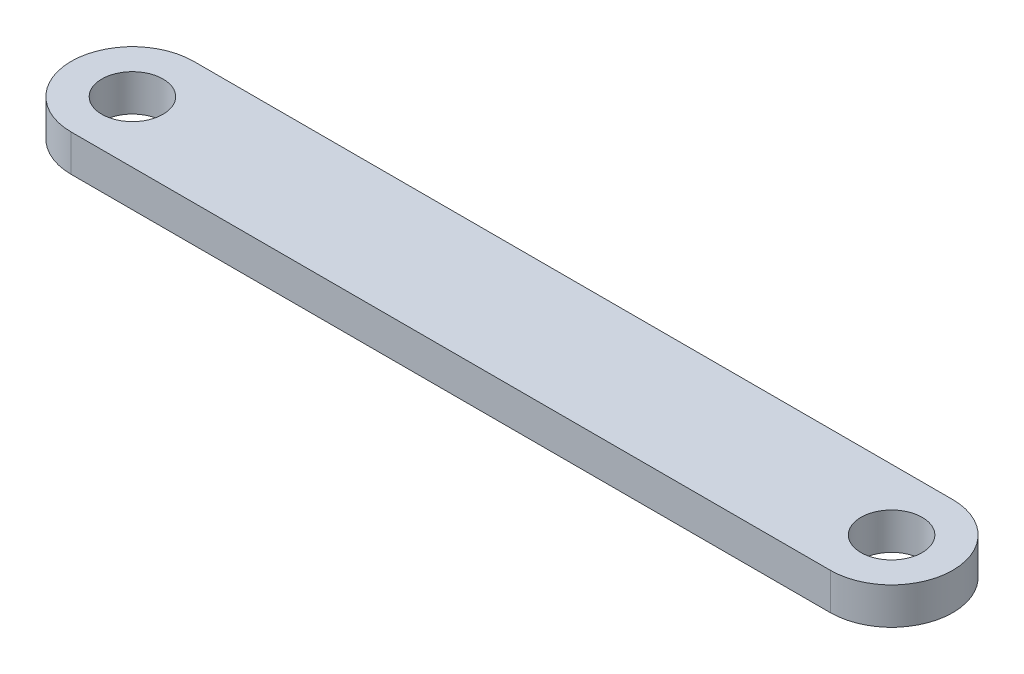
ISO-10303-21;
HEADER;
FILE_DESCRIPTION(('STEP AP214'),'2;1');
FILE_NAME('part.step','',(''),(''),'','','');
FILE_SCHEMA(('AUTOMOTIVE_DESIGN { 1 0 10303 214 1 1 1 1 }'));
ENDSEC;
DATA;
#1=APPLICATION_CONTEXT('core data for automotive mechanical design processes');
#2=APPLICATION_PROTOCOL_DEFINITION('international standard','automotive_design',2000,#1);
#3=PRODUCT_CONTEXT('',#1,'mechanical');
#4=PRODUCT('Part','Part','',(#3));
#5=PRODUCT_RELATED_PRODUCT_CATEGORY('part','',(#4));
#6=PRODUCT_DEFINITION_FORMATION('','',#4);
#7=PRODUCT_DEFINITION_CONTEXT('part definition',#1,'design');
#8=PRODUCT_DEFINITION('design','',#6,#7);
#9=PRODUCT_DEFINITION_SHAPE('','',#8);
#10=(LENGTH_UNIT() NAMED_UNIT(*) SI_UNIT(.MILLI.,.METRE.));
#11=(NAMED_UNIT(*) PLANE_ANGLE_UNIT() SI_UNIT($,.RADIAN.));
#12=(NAMED_UNIT(*) SI_UNIT($,.STERADIAN.) SOLID_ANGLE_UNIT());
#13=UNCERTAINTY_MEASURE_WITH_UNIT(LENGTH_MEASURE(1.E-05),#10,'distance_accuracy_value','');
#14=(GEOMETRIC_REPRESENTATION_CONTEXT(3) GLOBAL_UNCERTAINTY_ASSIGNED_CONTEXT((#13)) GLOBAL_UNIT_ASSIGNED_CONTEXT((#10,
#11,#12)) REPRESENTATION_CONTEXT('',''));
#15=CARTESIAN_POINT('',(0.,0.,0.));
#16=DIRECTION('',(0.,0.,1.));
#17=DIRECTION('',(1.,0.,0.));
#18=AXIS2_PLACEMENT_3D('',#15,#16,#17);
#19=CARTESIAN_POINT('',(-39.37,3.81,0.));
#20=DIRECTION('',(0.,1.,0.));
#21=DIRECTION('',(0.,0.,1.));
#22=AXIS2_PLACEMENT_3D('',#19,#20,#21);
#23=PLANE('',#22);
#24=CARTESIAN_POINT('',(-39.37,3.81,0.));
#25=DIRECTION('',(0.,1.,0.));
#26=DIRECTION('',(0.,0.,1.));
#27=AXIS2_PLACEMENT_3D('',#24,#25,#26);
#28=CIRCLE('',#27,3.17500000000001);
#29=CARTESIAN_POINT('',(-39.37,3.81,-3.17500000000001));
#30=VERTEX_POINT('',#29);
#31=EDGE_CURVE('E106',#30,#30,#28,.T.);
#32=ORIENTED_EDGE('',*,*,#31,.F.);
#33=EDGE_LOOP('',(#32));
#34=FACE_BOUND('',#33,.T.);
#35=CARTESIAN_POINT('',(-39.37,3.81,0.));
#36=DIRECTION('',(0.,1.,0.));
#37=DIRECTION('',(0.,0.,1.));
#38=AXIS2_PLACEMENT_3D('',#35,#36,#37);
#39=CIRCLE('',#38,6.35);
#40=CARTESIAN_POINT('',(-39.37,3.81,-6.35));
#41=VERTEX_POINT('',#40);
#42=CARTESIAN_POINT('',(-39.37,3.81,6.35));
#43=VERTEX_POINT('',#42);
#44=EDGE_CURVE('E91',#41,#43,#39,.T.);
#45=ORIENTED_EDGE('',*,*,#44,.T.);
#46=DIRECTION('',(1.,0.,0.));
#47=VECTOR('',#46,1.);
#48=CARTESIAN_POINT('',(-39.37,3.81,6.35));
#49=LINE('',#48,#47);
#50=CARTESIAN_POINT('',(39.37,3.81,6.34999999999999));
#51=VERTEX_POINT('',#50);
#52=EDGE_CURVE('E86',#43,#51,#49,.T.);
#53=ORIENTED_EDGE('',*,*,#52,.T.);
#54=CARTESIAN_POINT('',(39.37,3.81,0.));
#55=DIRECTION('',(0.,1.,0.));
#56=DIRECTION('',(0.,0.,1.));
#57=AXIS2_PLACEMENT_3D('',#54,#55,#56);
#58=CIRCLE('',#57,6.35);
#59=CARTESIAN_POINT('',(39.37,3.81,-6.35000000000001));
#60=VERTEX_POINT('',#59);
#61=EDGE_CURVE('E89',#51,#60,#58,.T.);
#62=ORIENTED_EDGE('',*,*,#61,.T.);
#63=DIRECTION('',(-1.,0.,0.));
#64=VECTOR('',#63,1.);
#65=CARTESIAN_POINT('',(-39.37,3.81,-6.35));
#66=LINE('',#65,#64);
#67=EDGE_CURVE('E56',#60,#41,#66,.T.);
#68=ORIENTED_EDGE('',*,*,#67,.T.);
#69=EDGE_LOOP('',(#45,#53,#62,#68));
#70=FACE_BOUND('',#69,.T.);
#71=CARTESIAN_POINT('',(39.37,3.81,0.));
#72=DIRECTION('',(0.,1.,0.));
#73=DIRECTION('',(0.,0.,1.));
#74=AXIS2_PLACEMENT_3D('',#71,#72,#73);
#75=CIRCLE('',#74,3.17500000000001);
#76=CARTESIAN_POINT('',(39.37,3.81,-3.17500000000002));
#77=VERTEX_POINT('',#76);
#78=EDGE_CURVE('E121',#77,#77,#75,.T.);
#79=ORIENTED_EDGE('',*,*,#78,.F.);
#80=EDGE_LOOP('',(#79));
#81=FACE_BOUND('',#80,.T.);
#82=ADVANCED_FACE('F39',(#34,#70,#81),#23,.T.);
#83=CARTESIAN_POINT('',(-39.37,0.,0.));
#84=DIRECTION('',(0.,1.,0.));
#85=DIRECTION('',(0.,0.,1.));
#86=AXIS2_PLACEMENT_3D('',#83,#84,#85);
#87=PLANE('',#86);
#88=CARTESIAN_POINT('',(-39.37,0.,0.));
#89=DIRECTION('',(0.,1.,0.));
#90=DIRECTION('',(0.,0.,1.));
#91=AXIS2_PLACEMENT_3D('',#88,#89,#90);
#92=CIRCLE('',#91,6.35);
#93=CARTESIAN_POINT('',(-39.37,0.,-6.35));
#94=VERTEX_POINT('',#93);
#95=CARTESIAN_POINT('',(-39.37,0.,6.35));
#96=VERTEX_POINT('',#95);
#97=EDGE_CURVE('E103',#94,#96,#92,.T.);
#98=ORIENTED_EDGE('',*,*,#97,.F.);
#99=DIRECTION('',(-1.,0.,0.));
#100=VECTOR('',#99,1.);
#101=CARTESIAN_POINT('',(-39.37,0.,-6.35));
#102=LINE('',#101,#100);
#103=CARTESIAN_POINT('',(39.37,0.,-6.35000000000001));
#104=VERTEX_POINT('',#103);
#105=EDGE_CURVE('E79',#104,#94,#102,.T.);
#106=ORIENTED_EDGE('',*,*,#105,.F.);
#107=CARTESIAN_POINT('',(39.37,0.,0.));
#108=DIRECTION('',(0.,1.,0.));
#109=DIRECTION('',(0.,0.,1.));
#110=AXIS2_PLACEMENT_3D('',#107,#108,#109);
#111=CIRCLE('',#110,6.35);
#112=CARTESIAN_POINT('',(39.37,0.,6.34999999999999));
#113=VERTEX_POINT('',#112);
#114=EDGE_CURVE('E73',#113,#104,#111,.T.);
#115=ORIENTED_EDGE('',*,*,#114,.F.);
#116=DIRECTION('',(1.,0.,0.));
#117=VECTOR('',#116,1.);
#118=CARTESIAN_POINT('',(-39.37,0.,6.35));
#119=LINE('',#118,#117);
#120=EDGE_CURVE('E95',#96,#113,#119,.T.);
#121=ORIENTED_EDGE('',*,*,#120,.F.);
#122=EDGE_LOOP('',(#98,#106,#115,#121));
#123=FACE_BOUND('',#122,.T.);
#124=CARTESIAN_POINT('',(-39.37,0.,0.));
#125=DIRECTION('',(0.,1.,0.));
#126=DIRECTION('',(0.,0.,1.));
#127=AXIS2_PLACEMENT_3D('',#124,#125,#126);
#128=CIRCLE('',#127,3.17500000000001);
#129=CARTESIAN_POINT('',(-39.37,0.,-3.17500000000001));
#130=VERTEX_POINT('',#129);
#131=EDGE_CURVE('E118',#130,#130,#128,.T.);
#132=ORIENTED_EDGE('',*,*,#131,.T.);
#133=EDGE_LOOP('',(#132));
#134=FACE_BOUND('',#133,.T.);
#135=CARTESIAN_POINT('',(39.37,0.,0.));
#136=DIRECTION('',(0.,1.,0.));
#137=DIRECTION('',(0.,0.,1.));
#138=AXIS2_PLACEMENT_3D('',#135,#136,#137);
#139=CIRCLE('',#138,3.17500000000001);
#140=CARTESIAN_POINT('',(39.37,0.,-3.17500000000002));
#141=VERTEX_POINT('',#140);
#142=EDGE_CURVE('E124',#141,#141,#139,.T.);
#143=ORIENTED_EDGE('',*,*,#142,.T.);
#144=EDGE_LOOP('',(#143));
#145=FACE_BOUND('',#144,.T.);
#146=ADVANCED_FACE('F114',(#123,#134,#145),#87,.F.);
#147=CARTESIAN_POINT('',(-39.37,3.81,0.));
#148=DIRECTION('',(0.,-1.,0.));
#149=DIRECTION('',(0.,0.,-1.));
#150=AXIS2_PLACEMENT_3D('',#147,#148,#149);
#151=CYLINDRICAL_SURFACE('',#150,6.35);
#152=ORIENTED_EDGE('',*,*,#97,.T.);
#153=DIRECTION('',(0.,-1.,0.));
#154=VECTOR('',#153,1.);
#155=CARTESIAN_POINT('',(-39.37,3.81,6.35));
#156=LINE('',#155,#154);
#157=EDGE_CURVE('E11',#43,#96,#156,.T.);
#158=ORIENTED_EDGE('',*,*,#157,.F.);
#159=ORIENTED_EDGE('',*,*,#44,.F.);
#160=DIRECTION('',(0.,-1.,0.));
#161=VECTOR('',#160,1.);
#162=CARTESIAN_POINT('',(-39.37,3.81,-6.35));
#163=LINE('',#162,#161);
#164=EDGE_CURVE('E99',#41,#94,#163,.T.);
#165=ORIENTED_EDGE('',*,*,#164,.T.);
#166=EDGE_LOOP('',(#152,#158,#159,#165));
#167=FACE_BOUND('',#166,.T.);
#168=ADVANCED_FACE('F41',(#167),#151,.T.);
#169=CARTESIAN_POINT('',(-39.37,3.81,6.35));
#170=DIRECTION('',(0.,0.,-1.));
#171=DIRECTION('',(-1.,0.,0.));
#172=AXIS2_PLACEMENT_3D('',#169,#170,#171);
#173=PLANE('',#172);
#174=ORIENTED_EDGE('',*,*,#120,.T.);
#175=DIRECTION('',(0.,-1.,0.));
#176=VECTOR('',#175,1.);
#177=CARTESIAN_POINT('',(39.37,3.81,6.34999999999999));
#178=LINE('',#177,#176);
#179=EDGE_CURVE('E48',#51,#113,#178,.T.);
#180=ORIENTED_EDGE('',*,*,#179,.F.);
#181=ORIENTED_EDGE('',*,*,#52,.F.);
#182=ORIENTED_EDGE('',*,*,#157,.T.);
#183=EDGE_LOOP('',(#174,#180,#181,#182));
#184=FACE_BOUND('',#183,.T.);
#185=ADVANCED_FACE('F94',(#184),#173,.F.);
#186=CARTESIAN_POINT('',(39.37,3.81,0.));
#187=DIRECTION('',(0.,-1.,0.));
#188=DIRECTION('',(0.,0.,-1.));
#189=AXIS2_PLACEMENT_3D('',#186,#187,#188);
#190=CYLINDRICAL_SURFACE('',#189,6.35);
#191=ORIENTED_EDGE('',*,*,#114,.T.);
#192=DIRECTION('',(0.,-1.,0.));
#193=VECTOR('',#192,1.);
#194=CARTESIAN_POINT('',(39.37,3.81,-6.35000000000001));
#195=LINE('',#194,#193);
#196=EDGE_CURVE('E96',#60,#104,#195,.T.);
#197=ORIENTED_EDGE('',*,*,#196,.F.);
#198=ORIENTED_EDGE('',*,*,#61,.F.);
#199=ORIENTED_EDGE('',*,*,#179,.T.);
#200=EDGE_LOOP('',(#191,#197,#198,#199));
#201=FACE_BOUND('',#200,.T.);
#202=ADVANCED_FACE('F97',(#201),#190,.T.);
#203=CARTESIAN_POINT('',(-39.37,3.81,-6.35));
#204=DIRECTION('',(0.,0.,1.));
#205=DIRECTION('',(1.,0.,0.));
#206=AXIS2_PLACEMENT_3D('',#203,#204,#205);
#207=PLANE('',#206);
#208=ORIENTED_EDGE('',*,*,#105,.T.);
#209=ORIENTED_EDGE('',*,*,#164,.F.);
#210=ORIENTED_EDGE('',*,*,#67,.F.);
#211=ORIENTED_EDGE('',*,*,#196,.T.);
#212=EDGE_LOOP('',(#208,#209,#210,#211));
#213=FACE_BOUND('',#212,.T.);
#214=ADVANCED_FACE('F111',(#213),#207,.F.);
#215=CARTESIAN_POINT('',(-39.37,3.81,0.));
#216=DIRECTION('',(0.,-1.,0.));
#217=DIRECTION('',(0.,0.,-1.));
#218=AXIS2_PLACEMENT_3D('',#215,#216,#217);
#219=CYLINDRICAL_SURFACE('',#218,3.17500000000001);
#220=CARTESIAN_POINT('',(-39.37,3.81,-3.17500000000001));
#221=CARTESIAN_POINT('',(-39.37,3.7703125,-3.17500000000001));
#222=CARTESIAN_POINT('',(-39.37,3.730625,-3.17500000000001));
#223=CARTESIAN_POINT('',(-39.37,3.65125,-3.17500000000001));
#224=CARTESIAN_POINT('',(-39.37,3.6115625,-3.17500000000001));
#225=CARTESIAN_POINT('',(-39.37,3.5321875,-3.17500000000001));
#226=CARTESIAN_POINT('',(-39.37,3.4925,-3.17500000000001));
#227=CARTESIAN_POINT('',(-39.37,3.413125,-3.17500000000001));
#228=CARTESIAN_POINT('',(-39.37,3.3734375,-3.17500000000001));
#229=CARTESIAN_POINT('',(-39.37,3.2940625,-3.17500000000001));
#230=CARTESIAN_POINT('',(-39.37,3.254375,-3.17500000000001));
#231=CARTESIAN_POINT('',(-39.37,3.175,-3.17500000000001));
#232=CARTESIAN_POINT('',(-39.37,3.1353125,-3.17500000000001));
#233=CARTESIAN_POINT('',(-39.37,3.0559375,-3.17500000000001));
#234=CARTESIAN_POINT('',(-39.37,3.01625,-3.17500000000001));
#235=CARTESIAN_POINT('',(-39.37,2.936875,-3.17500000000001));
#236=CARTESIAN_POINT('',(-39.37,2.8971875,-3.17500000000001));
#237=CARTESIAN_POINT('',(-39.37,2.8178125,-3.17500000000001));
#238=CARTESIAN_POINT('',(-39.37,2.778125,-3.17500000000001));
#239=CARTESIAN_POINT('',(-39.37,2.69875,-3.17500000000001));
#240=CARTESIAN_POINT('',(-39.37,2.6590625,-3.17500000000001));
#241=CARTESIAN_POINT('',(-39.37,2.5796875,-3.17500000000001));
#242=CARTESIAN_POINT('',(-39.37,2.54,-3.17500000000001));
#243=CARTESIAN_POINT('',(-39.37,2.460625,-3.17500000000001));
#244=CARTESIAN_POINT('',(-39.37,2.4209375,-3.17500000000001));
#245=CARTESIAN_POINT('',(-39.37,2.3415625,-3.17500000000001));
#246=CARTESIAN_POINT('',(-39.37,2.301875,-3.17500000000001));
#247=CARTESIAN_POINT('',(-39.37,2.2225,-3.17500000000001));
#248=CARTESIAN_POINT('',(-39.37,2.1828125,-3.17500000000001));
#249=CARTESIAN_POINT('',(-39.37,2.1034375,-3.17500000000001));
#250=CARTESIAN_POINT('',(-39.37,2.06375,-3.17500000000001));
#251=CARTESIAN_POINT('',(-39.37,1.984375,-3.17500000000001));
#252=CARTESIAN_POINT('',(-39.37,1.9446875,-3.17500000000001));
#253=CARTESIAN_POINT('',(-39.37,1.8653125,-3.17500000000001));
#254=CARTESIAN_POINT('',(-39.37,1.825625,-3.17500000000001));
#255=CARTESIAN_POINT('',(-39.37,1.74625,-3.17500000000001));
#256=CARTESIAN_POINT('',(-39.37,1.7065625,-3.17500000000001));
#257=CARTESIAN_POINT('',(-39.37,1.6271875,-3.17500000000001));
#258=CARTESIAN_POINT('',(-39.37,1.5875,-3.17500000000001));
#259=CARTESIAN_POINT('',(-39.37,1.508125,-3.17500000000001));
#260=CARTESIAN_POINT('',(-39.37,1.4684375,-3.17500000000001));
#261=CARTESIAN_POINT('',(-39.37,1.3890625,-3.17500000000001));
#262=CARTESIAN_POINT('',(-39.37,1.349375,-3.17500000000001));
#263=CARTESIAN_POINT('',(-39.37,1.27,-3.17500000000001));
#264=CARTESIAN_POINT('',(-39.37,1.2303125,-3.17500000000001));
#265=CARTESIAN_POINT('',(-39.37,1.1509375,-3.17500000000001));
#266=CARTESIAN_POINT('',(-39.37,1.11125,-3.17500000000001));
#267=CARTESIAN_POINT('',(-39.37,1.031875,-3.17500000000001));
#268=CARTESIAN_POINT('',(-39.37,0.9921875,-3.17500000000001));
#269=CARTESIAN_POINT('',(-39.37,0.9128125,-3.17500000000001));
#270=CARTESIAN_POINT('',(-39.37,0.873125,-3.17500000000001));
#271=CARTESIAN_POINT('',(-39.37,0.79375,-3.17500000000001));
#272=CARTESIAN_POINT('',(-39.37,0.7540625,-3.17500000000001));
#273=CARTESIAN_POINT('',(-39.37,0.6746875,-3.17500000000001));
#274=CARTESIAN_POINT('',(-39.37,0.635,-3.17500000000001));
#275=CARTESIAN_POINT('',(-39.37,0.555625,-3.17500000000001));
#276=CARTESIAN_POINT('',(-39.37,0.5159375,-3.17500000000001));
#277=CARTESIAN_POINT('',(-39.37,0.4365625,-3.17500000000001));
#278=CARTESIAN_POINT('',(-39.37,0.396875,-3.17500000000001));
#279=CARTESIAN_POINT('',(-39.37,0.3175,-3.17500000000001));
#280=CARTESIAN_POINT('',(-39.37,0.2778125,-3.17500000000001));
#281=CARTESIAN_POINT('',(-39.37,0.1984375,-3.17500000000001));
#282=CARTESIAN_POINT('',(-39.37,0.15875,-3.17500000000001));
#283=CARTESIAN_POINT('',(-39.37,0.0793749999999999,-3.17500000000001));
#284=CARTESIAN_POINT('',(-39.37,0.0396874999999999,-3.17500000000001));
#285=CARTESIAN_POINT('',(-39.37,0.,-3.17500000000001));
#286=B_SPLINE_CURVE_WITH_KNOTS('',3,(#220,#221,#222,#223,#224,#225,#226,#227,#228,#229,#230,
#231,#232,#233,#234,#235,#236,#237,#238,#239,#240,#241,#242,#243,#244,#245,#246,#247,#248,#249,
#250,#251,#252,#253,#254,#255,#256,#257,#258,#259,#260,#261,#262,#263,#264,#265,#266,#267,#268,
#269,#270,#271,#272,#273,#274,#275,#276,#277,#278,#279,#280,#281,#282,#283,#284,#285),
.UNSPECIFIED.,.F.,.F.,(4,2,2,2,2,2,2,2,2,2,2,2,2,2,2,2,2,2,2,2,2,2,2,2,2,2,2,2,2,2,2,2,4),(0.,
0.1190625,0.238125,0.3571875,0.47625,0.595312499999999,0.714375,0.833437499999999,
0.952499999999999,1.0715625,1.190625,1.3096875,1.42875,1.5478125,1.666875,1.7859375,1.905,
2.0240625,2.143125,2.2621875,2.38125,2.5003125,2.619375,2.7384375,2.8575,2.9765625,3.095625,
3.2146875,3.33375,3.4528125,3.571875,3.6909375,3.81),.UNSPECIFIED.);
#287=EDGE_CURVE('BSEAM141',#30,#130,#286,.T.);
#288=ORIENTED_EDGE('',*,*,#31,.T.);
#289=ORIENTED_EDGE('',*,*,#131,.F.);
#290=ORIENTED_EDGE('',*,*,#287,.T.);
#291=ORIENTED_EDGE('',*,*,#287,.F.);
#292=EDGE_LOOP('',(#288,#290,#289,#291));
#293=FACE_BOUND('',#292,.T.);
#294=ADVANCED_FACE('F141',(#293),#219,.F.);
#295=CARTESIAN_POINT('',(39.37,3.81,0.));
#296=DIRECTION('',(0.,-1.,0.));
#297=DIRECTION('',(0.,0.,-1.));
#298=AXIS2_PLACEMENT_3D('',#295,#296,#297);
#299=CYLINDRICAL_SURFACE('',#298,3.17500000000001);
#300=CARTESIAN_POINT('',(39.37,3.81,-3.17500000000002));
#301=CARTESIAN_POINT('',(39.37,3.7703125,-3.17500000000002));
#302=CARTESIAN_POINT('',(39.37,3.730625,-3.17500000000002));
#303=CARTESIAN_POINT('',(39.37,3.65125,-3.17500000000002));
#304=CARTESIAN_POINT('',(39.37,3.6115625,-3.17500000000002));
#305=CARTESIAN_POINT('',(39.37,3.5321875,-3.17500000000002));
#306=CARTESIAN_POINT('',(39.37,3.4925,-3.17500000000002));
#307=CARTESIAN_POINT('',(39.37,3.413125,-3.17500000000002));
#308=CARTESIAN_POINT('',(39.37,3.3734375,-3.17500000000002));
#309=CARTESIAN_POINT('',(39.37,3.2940625,-3.17500000000002));
#310=CARTESIAN_POINT('',(39.37,3.254375,-3.17500000000002));
#311=CARTESIAN_POINT('',(39.37,3.175,-3.17500000000002));
#312=CARTESIAN_POINT('',(39.37,3.1353125,-3.17500000000002));
#313=CARTESIAN_POINT('',(39.37,3.0559375,-3.17500000000002));
#314=CARTESIAN_POINT('',(39.37,3.01625,-3.17500000000002));
#315=CARTESIAN_POINT('',(39.37,2.936875,-3.17500000000002));
#316=CARTESIAN_POINT('',(39.37,2.8971875,-3.17500000000002));
#317=CARTESIAN_POINT('',(39.37,2.8178125,-3.17500000000002));
#318=CARTESIAN_POINT('',(39.37,2.778125,-3.17500000000002));
#319=CARTESIAN_POINT('',(39.37,2.69875,-3.17500000000002));
#320=CARTESIAN_POINT('',(39.37,2.6590625,-3.17500000000002));
#321=CARTESIAN_POINT('',(39.37,2.5796875,-3.17500000000002));
#322=CARTESIAN_POINT('',(39.37,2.54,-3.17500000000002));
#323=CARTESIAN_POINT('',(39.37,2.460625,-3.17500000000002));
#324=CARTESIAN_POINT('',(39.37,2.4209375,-3.17500000000002));
#325=CARTESIAN_POINT('',(39.37,2.3415625,-3.17500000000002));
#326=CARTESIAN_POINT('',(39.37,2.301875,-3.17500000000002));
#327=CARTESIAN_POINT('',(39.37,2.2225,-3.17500000000002));
#328=CARTESIAN_POINT('',(39.37,2.1828125,-3.17500000000002));
#329=CARTESIAN_POINT('',(39.37,2.1034375,-3.17500000000002));
#330=CARTESIAN_POINT('',(39.37,2.06375,-3.17500000000002));
#331=CARTESIAN_POINT('',(39.37,1.984375,-3.17500000000002));
#332=CARTESIAN_POINT('',(39.37,1.9446875,-3.17500000000002));
#333=CARTESIAN_POINT('',(39.37,1.8653125,-3.17500000000002));
#334=CARTESIAN_POINT('',(39.37,1.825625,-3.17500000000002));
#335=CARTESIAN_POINT('',(39.37,1.74625,-3.17500000000002));
#336=CARTESIAN_POINT('',(39.37,1.7065625,-3.17500000000002));
#337=CARTESIAN_POINT('',(39.37,1.6271875,-3.17500000000002));
#338=CARTESIAN_POINT('',(39.37,1.5875,-3.17500000000002));
#339=CARTESIAN_POINT('',(39.37,1.508125,-3.17500000000002));
#340=CARTESIAN_POINT('',(39.37,1.4684375,-3.17500000000002));
#341=CARTESIAN_POINT('',(39.37,1.3890625,-3.17500000000002));
#342=CARTESIAN_POINT('',(39.37,1.349375,-3.17500000000002));
#343=CARTESIAN_POINT('',(39.37,1.27,-3.17500000000002));
#344=CARTESIAN_POINT('',(39.37,1.2303125,-3.17500000000002));
#345=CARTESIAN_POINT('',(39.37,1.1509375,-3.17500000000002));
#346=CARTESIAN_POINT('',(39.37,1.11125,-3.17500000000002));
#347=CARTESIAN_POINT('',(39.37,1.031875,-3.17500000000002));
#348=CARTESIAN_POINT('',(39.37,0.9921875,-3.17500000000002));
#349=CARTESIAN_POINT('',(39.37,0.9128125,-3.17500000000002));
#350=CARTESIAN_POINT('',(39.37,0.873125,-3.17500000000002));
#351=CARTESIAN_POINT('',(39.37,0.79375,-3.17500000000002));
#352=CARTESIAN_POINT('',(39.37,0.7540625,-3.17500000000002));
#353=CARTESIAN_POINT('',(39.37,0.6746875,-3.17500000000002));
#354=CARTESIAN_POINT('',(39.37,0.635,-3.17500000000002));
#355=CARTESIAN_POINT('',(39.37,0.555625,-3.17500000000002));
#356=CARTESIAN_POINT('',(39.37,0.5159375,-3.17500000000002));
#357=CARTESIAN_POINT('',(39.37,0.4365625,-3.17500000000002));
#358=CARTESIAN_POINT('',(39.37,0.396875,-3.17500000000002));
#359=CARTESIAN_POINT('',(39.37,0.3175,-3.17500000000002));
#360=CARTESIAN_POINT('',(39.37,0.2778125,-3.17500000000002));
#361=CARTESIAN_POINT('',(39.37,0.1984375,-3.17500000000002));
#362=CARTESIAN_POINT('',(39.37,0.15875,-3.17500000000002));
#363=CARTESIAN_POINT('',(39.37,0.0793749999999999,-3.17500000000002));
#364=CARTESIAN_POINT('',(39.37,0.0396874999999999,-3.17500000000002));
#365=CARTESIAN_POINT('',(39.37,0.,-3.17500000000002));
#366=B_SPLINE_CURVE_WITH_KNOTS('',3,(#300,#301,#302,#303,#304,#305,#306,#307,#308,#309,#310,
#311,#312,#313,#314,#315,#316,#317,#318,#319,#320,#321,#322,#323,#324,#325,#326,#327,#328,#329,
#330,#331,#332,#333,#334,#335,#336,#337,#338,#339,#340,#341,#342,#343,#344,#345,#346,#347,#348,
#349,#350,#351,#352,#353,#354,#355,#356,#357,#358,#359,#360,#361,#362,#363,#364,#365),
.UNSPECIFIED.,.F.,.F.,(4,2,2,2,2,2,2,2,2,2,2,2,2,2,2,2,2,2,2,2,2,2,2,2,2,2,2,2,2,2,2,2,4),(0.,
0.1190625,0.238125,0.3571875,0.47625,0.595312499999999,0.714375,0.833437499999999,
0.952499999999999,1.0715625,1.190625,1.3096875,1.42875,1.5478125,1.666875,1.7859375,1.905,
2.0240625,2.143125,2.2621875,2.38125,2.5003125,2.619375,2.7384375,2.8575,2.9765625,3.095625,
3.2146875,3.33375,3.4528125,3.571875,3.6909375,3.81),.UNSPECIFIED.);
#367=EDGE_CURVE('BSEAM130',#77,#141,#366,.T.);
#368=ORIENTED_EDGE('',*,*,#78,.T.);
#369=ORIENTED_EDGE('',*,*,#142,.F.);
#370=ORIENTED_EDGE('',*,*,#367,.T.);
#371=ORIENTED_EDGE('',*,*,#367,.F.);
#372=EDGE_LOOP('',(#368,#370,#369,#371));
#373=FACE_BOUND('',#372,.T.);
#374=ADVANCED_FACE('F130',(#373),#299,.F.);
#375=CLOSED_SHELL('',(#82,#146,#168,#185,#202,#214,#294,#374));
#376=MANIFOLD_SOLID_BREP('B2',#375);
#377=ADVANCED_BREP_SHAPE_REPRESENTATION('',(#18,#376),#14);
#378=SHAPE_DEFINITION_REPRESENTATION(#9,#377);
ENDSEC;
END-ISO-10303-21;
